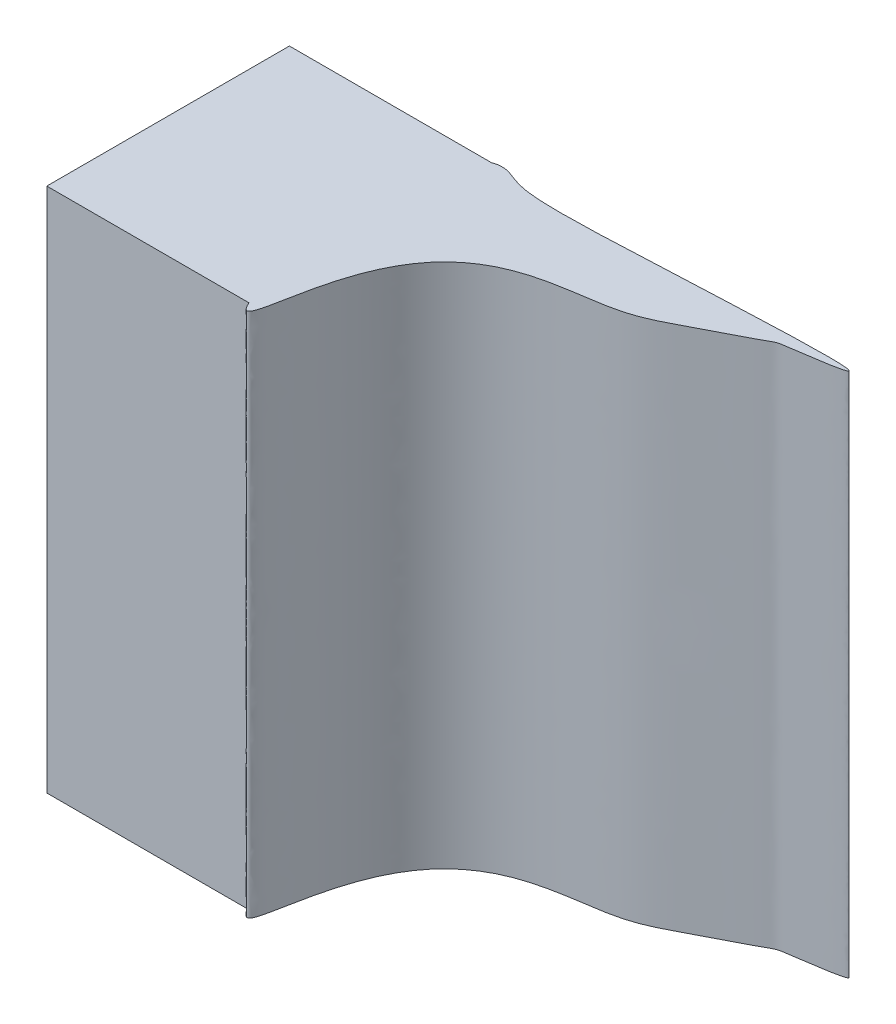
ISO-10303-21;
HEADER;
FILE_DESCRIPTION(('STEP AP214'),'2;1');
FILE_NAME('part.step','',(''),(''),'','','');
FILE_SCHEMA(('AUTOMOTIVE_DESIGN { 1 0 10303 214 1 1 1 1 }'));
ENDSEC;
DATA;
#1=APPLICATION_CONTEXT('core data for automotive mechanical design processes');
#2=APPLICATION_PROTOCOL_DEFINITION('international standard','automotive_design',2000,#1);
#3=PRODUCT_CONTEXT('',#1,'mechanical');
#4=PRODUCT('Part','Part','',(#3));
#5=PRODUCT_RELATED_PRODUCT_CATEGORY('part','',(#4));
#6=PRODUCT_DEFINITION_FORMATION('','',#4);
#7=PRODUCT_DEFINITION_CONTEXT('part definition',#1,'design');
#8=PRODUCT_DEFINITION('design','',#6,#7);
#9=PRODUCT_DEFINITION_SHAPE('','',#8);
#10=(LENGTH_UNIT() NAMED_UNIT(*) SI_UNIT(.MILLI.,.METRE.));
#11=(NAMED_UNIT(*) PLANE_ANGLE_UNIT() SI_UNIT($,.RADIAN.));
#12=(NAMED_UNIT(*) SI_UNIT($,.STERADIAN.) SOLID_ANGLE_UNIT());
#13=UNCERTAINTY_MEASURE_WITH_UNIT(LENGTH_MEASURE(1.E-05),#10,'distance_accuracy_value','');
#14=(GEOMETRIC_REPRESENTATION_CONTEXT(3) GLOBAL_UNCERTAINTY_ASSIGNED_CONTEXT((#13)) GLOBAL_UNIT_ASSIGNED_CONTEXT((#10,
#11,#12)) REPRESENTATION_CONTEXT('',''));
#15=CARTESIAN_POINT('',(0.,0.,0.));
#16=DIRECTION('',(0.,0.,1.));
#17=DIRECTION('',(1.,0.,0.));
#18=AXIS2_PLACEMENT_3D('',#15,#16,#17);
#19=CARTESIAN_POINT('',(1.5,-0.65,0.6));
#20=CARTESIAN_POINT('',(1.5,0.65,0.6));
#21=CARTESIAN_POINT('',(1.504563881529,-0.65,0.610404780283));
#22=CARTESIAN_POINT('',(1.504563881529,0.65,0.610404780283));
#23=CARTESIAN_POINT('',(1.51291263196,-0.65,0.624257488839));
#24=CARTESIAN_POINT('',(1.51291263196,0.65,0.624257488839));
#25=CARTESIAN_POINT('',(1.522864963608,-0.65,0.623392181737));
#26=CARTESIAN_POINT('',(1.522864963608,0.65,0.623392181737));
#27=CARTESIAN_POINT('',(1.532376448188,-0.65,0.581336485311));
#28=CARTESIAN_POINT('',(1.532376448188,0.65,0.581336485311));
#29=CARTESIAN_POINT('',(1.547947909724,-0.65,0.484019566067));
#30=CARTESIAN_POINT('',(1.547947909724,0.65,0.484019566067));
#31=CARTESIAN_POINT('',(1.578830397876,-0.65,0.373071930224));
#32=CARTESIAN_POINT('',(1.578830397876,0.65,0.373071930224));
#33=CARTESIAN_POINT('',(1.633802177616,-0.65,0.277950911439));
#34=CARTESIAN_POINT('',(1.633802177616,0.65,0.277950911439));
#35=CARTESIAN_POINT('',(1.713236071597,-0.65,0.215989500569));
#36=CARTESIAN_POINT('',(1.713236071597,0.65,0.215989500569));
#37=CARTESIAN_POINT('',(1.806406048399,-0.65,0.185155259637));
#38=CARTESIAN_POINT('',(1.806406048399,0.65,0.185155259637));
#39=CARTESIAN_POINT('',(1.897839138036,-0.65,0.172669764408));
#40=CARTESIAN_POINT('',(1.897839138036,0.65,0.172669764408));
#41=CARTESIAN_POINT('',(1.976564091535,-0.65,0.162197163572));
#42=CARTESIAN_POINT('',(1.976564091535,0.65,0.162197163572));
#43=CARTESIAN_POINT('',(2.035852670036,-0.65,0.14014814257));
#44=CARTESIAN_POINT('',(2.035852670036,0.65,0.14014814257));
#45=CARTESIAN_POINT('',(2.096485195646,-0.65,0.105588225382));
#46=CARTESIAN_POINT('',(2.096485195646,0.65,0.105588225382));
#47=CARTESIAN_POINT('',(2.167563170438,-0.65,0.07003553460717));
#48=CARTESIAN_POINT('',(2.167563170438,0.65,0.07003553460717));
#49=CARTESIAN_POINT('',(2.218987488853,-0.65,0.04346748421527));
#50=CARTESIAN_POINT('',(2.218987488853,0.65,0.04346748421527));
#51=CARTESIAN_POINT('',(2.238134291571,-0.65,0.03135503652995));
#52=CARTESIAN_POINT('',(2.238134291571,0.65,0.03135503652995));
#53=CARTESIAN_POINT('',(2.242100979653,-0.65,0.03023663656303));
#54=CARTESIAN_POINT('',(2.242100979653,0.65,0.03023663656303));
#55=CARTESIAN_POINT('',(2.349513732147,-0.65,0.01678314554924));
#56=CARTESIAN_POINT('',(2.349513732147,0.65,0.01678314554924));
#57=CARTESIAN_POINT('',(2.433373343115,-0.65,-0.000462774260499));
#58=CARTESIAN_POINT('',(2.433373343115,0.65,-0.000462774260499));
#59=CARTESIAN_POINT('',(2.325814089705,-0.65,-0.004656521855149));
#60=CARTESIAN_POINT('',(2.325814089705,0.65,-0.004656521855149));
#61=CARTESIAN_POINT('',(2.038956687411,-0.65,0.008440608186372));
#62=CARTESIAN_POINT('',(2.038956687411,0.65,0.008440608186372));
#63=CARTESIAN_POINT('',(1.800875753985,-0.65,0.02072388478313));
#64=CARTESIAN_POINT('',(1.800875753985,0.65,0.02072388478313));
#65=CARTESIAN_POINT('',(1.646458917729,-0.65,0.0248351741419));
#66=CARTESIAN_POINT('',(1.646458917729,0.65,0.0248351741419));
#67=CARTESIAN_POINT('',(1.578984922667,-0.65,0.01640871735164));
#68=CARTESIAN_POINT('',(1.578984922667,0.65,0.01640871735164));
#69=CARTESIAN_POINT('',(1.554976548618,-0.65,0.002515794827033));
#70=CARTESIAN_POINT('',(1.554976548618,0.65,0.002515794827033));
#71=CARTESIAN_POINT('',(1.533569070842,-0.65,-0.00564584669718));
#72=CARTESIAN_POINT('',(1.533569070842,0.65,-0.00564584669718));
#73=CARTESIAN_POINT('',(1.514220808572,-0.65,-0.004760420093226));
#74=CARTESIAN_POINT('',(1.514220808572,0.65,-0.004760420093226));
#75=CARTESIAN_POINT('',(1.502679526612,-0.65,-0.001040931875245));
#76=CARTESIAN_POINT('',(1.502679526612,0.65,-0.001040931875245));
#77=CARTESIAN_POINT('',(1.5,-0.65,0.));
#78=CARTESIAN_POINT('',(1.5,0.65,0.));
#79=B_SPLINE_SURFACE_WITH_KNOTS('',5,1,((#19,#20),(#21,#22),(#23,#24),(#25,#26),(#27,#28),(#29,
#30),(#31,#32),(#33,#34),(#35,#36),(#37,#38),(#39,#40),(#41,#42),(#43,#44),(#45,#46),(#47,#48),
(#49,#50),(#51,#52),(#53,#54),(#55,#56),(#57,#58),(#59,#60),(#61,#62),(#63,#64),(#65,#66),(#67,
#68),(#69,#70),(#71,#72),(#73,#74),(#75,#76),(#77,#78)),.UNSPECIFIED.,.F.,.F.,.F.,(6,1,1,1,1,1,
1,1,1,1,1,1,1,1,1,1,1,1,1,1,1,1,1,1,1,6),(2,2),(0.,0.03333333333333,0.06666666666667,0.1,
0.133333333333,0.166666666667,0.2,0.233333333333,0.266666666667,0.3,0.333333333333,
0.366666666667,0.4,0.433333333333,0.466666666667,0.5,0.533333333333,0.566666666667,0.6,
0.633333333333,0.666666666667,0.7,0.733333333333,0.766666666667,0.8,0.809978898937),(0.,0.13),.UNSPECIFIED.);
#80=CARTESIAN_POINT('',(1.5,-0.65,0.6));
#81=CARTESIAN_POINT('',(1.504563881529,-0.65,0.610404780283));
#82=CARTESIAN_POINT('',(1.51291263196,-0.65,0.624257488839));
#83=CARTESIAN_POINT('',(1.522864963608,-0.65,0.623392181737));
#84=CARTESIAN_POINT('',(1.532376448188,-0.65,0.581336485311));
#85=CARTESIAN_POINT('',(1.547947909724,-0.65,0.484019566067));
#86=CARTESIAN_POINT('',(1.578830397876,-0.65,0.373071930224));
#87=CARTESIAN_POINT('',(1.633802177616,-0.65,0.277950911439));
#88=CARTESIAN_POINT('',(1.713236071597,-0.65,0.215989500569));
#89=CARTESIAN_POINT('',(1.806406048399,-0.65,0.185155259637));
#90=CARTESIAN_POINT('',(1.897839138036,-0.65,0.172669764408));
#91=CARTESIAN_POINT('',(1.976564091535,-0.65,0.162197163572));
#92=CARTESIAN_POINT('',(2.035852670036,-0.65,0.14014814257));
#93=CARTESIAN_POINT('',(2.096485195646,-0.65,0.105588225382));
#94=CARTESIAN_POINT('',(2.167563170438,-0.65,0.07003553460717));
#95=CARTESIAN_POINT('',(2.218987488853,-0.65,0.04346748421527));
#96=CARTESIAN_POINT('',(2.238134291571,-0.65,0.03135503652995));
#97=CARTESIAN_POINT('',(2.242100979653,-0.65,0.03023663656303));
#98=CARTESIAN_POINT('',(2.349513732147,-0.65,0.01678314554924));
#99=CARTESIAN_POINT('',(2.433373343115,-0.65,-0.000462774260499));
#100=CARTESIAN_POINT('',(2.325814089705,-0.65,-0.004656521855149));
#101=CARTESIAN_POINT('',(2.038956687411,-0.65,0.008440608186372));
#102=CARTESIAN_POINT('',(1.800875753985,-0.65,0.02072388478313));
#103=CARTESIAN_POINT('',(1.646458917729,-0.65,0.0248351741419));
#104=CARTESIAN_POINT('',(1.578984922667,-0.65,0.01640871735164));
#105=CARTESIAN_POINT('',(1.554976548618,-0.65,0.002515794827033));
#106=CARTESIAN_POINT('',(1.533569070842,-0.65,-0.00564584669718));
#107=CARTESIAN_POINT('',(1.514220808572,-0.65,-0.004760420093226));
#108=CARTESIAN_POINT('',(1.502679526612,-0.65,-0.001040931875245));
#109=CARTESIAN_POINT('',(1.5,-0.65,0.));
#110=B_SPLINE_CURVE_WITH_KNOTS('',5,(#80,#81,#82,#83,#84,#85,#86,#87,#88,#89,#90,#91,#92,#93,
#94,#95,#96,#97,#98,#99,#100,#101,#102,#103,#104,#105,#106,#107,#108,#109),.UNSPECIFIED.,.F.,
.F.,(6,1,1,1,1,1,1,1,1,1,1,1,1,1,1,1,1,1,1,1,1,1,1,1,1,6),(0.,0.03333333333333,0.06666666666667,
0.1,0.133333333333,0.166666666667,0.2,0.233333333333,0.266666666667,0.3,0.333333333333,
0.366666666667,0.4,0.433333333333,0.466666666667,0.5,0.533333333333,0.566666666667,0.6,
0.633333333333,0.666666666667,0.7,0.733333333333,0.766666666667,0.8,0.809978898937),.UNSPECIFIED.);
#111=CARTESIAN_POINT('',(1.5,-0.65,0.6));
#112=VERTEX_POINT('',#111);
#113=CARTESIAN_POINT('',(1.5,-0.65,0.));
#114=VERTEX_POINT('',#113);
#115=EDGE_CURVE('E11',#112,#114,#110,.T.);
#116=DIRECTION('',(0.,-1.,0.));
#117=VECTOR('',#116,1.);
#118=CARTESIAN_POINT('',(1.5,0.65,0.));
#119=LINE('',#118,#117);
#120=CARTESIAN_POINT('',(1.5,0.65,0.));
#121=VERTEX_POINT('',#120);
#122=EDGE_CURVE('E36',#121,#114,#119,.T.);
#123=CARTESIAN_POINT('',(1.5,0.65,0.6));
#124=CARTESIAN_POINT('',(1.504563881529,0.65,0.610404780283));
#125=CARTESIAN_POINT('',(1.51291263196,0.65,0.624257488839));
#126=CARTESIAN_POINT('',(1.522864963608,0.65,0.623392181737));
#127=CARTESIAN_POINT('',(1.532376448188,0.65,0.581336485311));
#128=CARTESIAN_POINT('',(1.547947909724,0.65,0.484019566067));
#129=CARTESIAN_POINT('',(1.578830397876,0.65,0.373071930224));
#130=CARTESIAN_POINT('',(1.633802177616,0.65,0.277950911439));
#131=CARTESIAN_POINT('',(1.713236071597,0.65,0.215989500569));
#132=CARTESIAN_POINT('',(1.806406048399,0.65,0.185155259637));
#133=CARTESIAN_POINT('',(1.897839138036,0.65,0.172669764408));
#134=CARTESIAN_POINT('',(1.976564091535,0.65,0.162197163572));
#135=CARTESIAN_POINT('',(2.035852670036,0.65,0.14014814257));
#136=CARTESIAN_POINT('',(2.096485195646,0.65,0.105588225382));
#137=CARTESIAN_POINT('',(2.167563170438,0.65,0.07003553460717));
#138=CARTESIAN_POINT('',(2.218987488853,0.65,0.04346748421527));
#139=CARTESIAN_POINT('',(2.238134291571,0.65,0.03135503652995));
#140=CARTESIAN_POINT('',(2.242100979653,0.65,0.03023663656303));
#141=CARTESIAN_POINT('',(2.349513732147,0.65,0.01678314554924));
#142=CARTESIAN_POINT('',(2.433373343115,0.65,-0.000462774260499));
#143=CARTESIAN_POINT('',(2.325814089705,0.65,-0.004656521855149));
#144=CARTESIAN_POINT('',(2.038956687411,0.65,0.008440608186372));
#145=CARTESIAN_POINT('',(1.800875753985,0.65,0.02072388478313));
#146=CARTESIAN_POINT('',(1.646458917729,0.65,0.0248351741419));
#147=CARTESIAN_POINT('',(1.578984922667,0.65,0.01640871735164));
#148=CARTESIAN_POINT('',(1.554976548618,0.65,0.002515794827033));
#149=CARTESIAN_POINT('',(1.533569070842,0.65,-0.00564584669718));
#150=CARTESIAN_POINT('',(1.514220808572,0.65,-0.004760420093226));
#151=CARTESIAN_POINT('',(1.502679526612,0.65,-0.001040931875245));
#152=CARTESIAN_POINT('',(1.5,0.65,0.));
#153=B_SPLINE_CURVE_WITH_KNOTS('',5,(#123,#124,#125,#126,#127,#128,#129,#130,#131,#132,#133,
#134,#135,#136,#137,#138,#139,#140,#141,#142,#143,#144,#145,#146,#147,#148,#149,#150,#151,#152),
.UNSPECIFIED.,.F.,.F.,(6,1,1,1,1,1,1,1,1,1,1,1,1,1,1,1,1,1,1,1,1,1,1,1,1,6),(0.,
0.03333333333333,0.06666666666667,0.1,0.133333333333,0.166666666667,0.2,0.233333333333,
0.266666666667,0.3,0.333333333333,0.366666666667,0.4,0.433333333333,0.466666666667,0.5,
0.533333333333,0.566666666667,0.6,0.633333333333,0.666666666667,0.7,0.733333333333,
0.766666666667,0.8,0.809978898937),.UNSPECIFIED.);
#154=CARTESIAN_POINT('',(1.5,0.65,0.6));
#155=VERTEX_POINT('',#154);
#156=EDGE_CURVE('E68',#155,#121,#153,.T.);
#157=DIRECTION('',(0.,1.,0.));
#158=VECTOR('',#157,1.);
#159=CARTESIAN_POINT('',(1.5,0.65,0.6));
#160=LINE('',#159,#158);
#161=EDGE_CURVE('E79',#112,#155,#160,.T.);
#162=ORIENTED_EDGE('',*,*,#115,.T.);
#163=ORIENTED_EDGE('',*,*,#122,.F.);
#164=ORIENTED_EDGE('',*,*,#156,.F.);
#165=ORIENTED_EDGE('',*,*,#161,.F.);
#166=EDGE_LOOP('',(#162,#163,#164,#165));
#167=FACE_BOUND('',#166,.T.);
#168=ADVANCED_FACE('F17',(#167),#79,.T.);
#169=CARTESIAN_POINT('',(1.,0.,0.3));
#170=DIRECTION('',(1.,0.,0.));
#171=DIRECTION('',(0.,0.,-1.));
#172=AXIS2_PLACEMENT_3D('',#169,#170,#171);
#173=PLANE('',#172);
#174=DIRECTION('',(0.,0.,-1.));
#175=VECTOR('',#174,1.);
#176=CARTESIAN_POINT('',(1.,-0.65,0.15));
#177=LINE('',#176,#175);
#178=CARTESIAN_POINT('',(1.,-0.65,0.6));
#179=VERTEX_POINT('',#178);
#180=CARTESIAN_POINT('',(1.,-0.65,0.));
#181=VERTEX_POINT('',#180);
#182=EDGE_CURVE('E62',#179,#181,#177,.T.);
#183=ORIENTED_EDGE('',*,*,#182,.F.);
#184=DIRECTION('',(0.,-1.,0.));
#185=VECTOR('',#184,1.);
#186=CARTESIAN_POINT('',(1.,0.,0.6));
#187=LINE('',#186,#185);
#188=CARTESIAN_POINT('',(1.,0.65,0.6));
#189=VERTEX_POINT('',#188);
#190=EDGE_CURVE('E54',#189,#179,#187,.T.);
#191=ORIENTED_EDGE('',*,*,#190,.F.);
#192=DIRECTION('',(0.,0.,1.));
#193=VECTOR('',#192,1.);
#194=CARTESIAN_POINT('',(1.,0.65,0.15));
#195=LINE('',#194,#193);
#196=CARTESIAN_POINT('',(1.,0.65,0.));
#197=VERTEX_POINT('',#196);
#198=EDGE_CURVE('E27',#197,#189,#195,.T.);
#199=ORIENTED_EDGE('',*,*,#198,.F.);
#200=DIRECTION('',(0.,1.,0.));
#201=VECTOR('',#200,1.);
#202=CARTESIAN_POINT('',(1.,0.,0.));
#203=LINE('',#202,#201);
#204=EDGE_CURVE('E57',#181,#197,#203,.T.);
#205=ORIENTED_EDGE('',*,*,#204,.F.);
#206=EDGE_LOOP('',(#183,#191,#199,#205));
#207=FACE_BOUND('',#206,.T.);
#208=ADVANCED_FACE('F64',(#207),#173,.F.);
#209=CARTESIAN_POINT('',(1.5,0.65,0.));
#210=DIRECTION('',(0.,1.,0.));
#211=DIRECTION('',(-1.,0.,0.));
#212=AXIS2_PLACEMENT_3D('',#209,#210,#211);
#213=PLANE('',#212);
#214=ORIENTED_EDGE('',*,*,#198,.T.);
#215=DIRECTION('',(-1.,0.,0.));
#216=VECTOR('',#215,1.);
#217=CARTESIAN_POINT('',(-1.5,0.65,0.6));
#218=LINE('',#217,#216);
#219=EDGE_CURVE('E76',#155,#189,#218,.T.);
#220=ORIENTED_EDGE('',*,*,#219,.F.);
#221=ORIENTED_EDGE('',*,*,#156,.T.);
#222=DIRECTION('',(1.,0.,0.));
#223=VECTOR('',#222,1.);
#224=CARTESIAN_POINT('',(-1.5,0.65,0.));
#225=LINE('',#224,#223);
#226=EDGE_CURVE('E59',#197,#121,#225,.T.);
#227=ORIENTED_EDGE('',*,*,#226,.F.);
#228=EDGE_LOOP('',(#214,#220,#221,#227));
#229=FACE_BOUND('',#228,.T.);
#230=ADVANCED_FACE('F71',(#229),#213,.T.);
#231=CARTESIAN_POINT('',(0.,0.,0.6));
#232=DIRECTION('',(0.,0.,1.));
#233=DIRECTION('',(1.,0.,0.));
#234=AXIS2_PLACEMENT_3D('',#231,#232,#233);
#235=PLANE('',#234);
#236=ORIENTED_EDGE('',*,*,#190,.T.);
#237=DIRECTION('',(1.,0.,0.));
#238=VECTOR('',#237,1.);
#239=CARTESIAN_POINT('',(1.5,-0.65,0.6));
#240=LINE('',#239,#238);
#241=EDGE_CURVE('E77',#179,#112,#240,.T.);
#242=ORIENTED_EDGE('',*,*,#241,.T.);
#243=ORIENTED_EDGE('',*,*,#161,.T.);
#244=ORIENTED_EDGE('',*,*,#219,.T.);
#245=EDGE_LOOP('',(#236,#242,#243,#244));
#246=FACE_BOUND('',#245,.T.);
#247=ADVANCED_FACE('F92',(#246),#235,.T.);
#248=CARTESIAN_POINT('',(-1.5,-0.65,0.));
#249=DIRECTION('',(0.,-1.,0.));
#250=DIRECTION('',(1.,0.,0.));
#251=AXIS2_PLACEMENT_3D('',#248,#249,#250);
#252=PLANE('',#251);
#253=ORIENTED_EDGE('',*,*,#182,.T.);
#254=DIRECTION('',(-1.,0.,0.));
#255=VECTOR('',#254,1.);
#256=CARTESIAN_POINT('',(1.5,-0.65,0.));
#257=LINE('',#256,#255);
#258=EDGE_CURVE('E21',#114,#181,#257,.T.);
#259=ORIENTED_EDGE('',*,*,#258,.F.);
#260=ORIENTED_EDGE('',*,*,#115,.F.);
#261=ORIENTED_EDGE('',*,*,#241,.F.);
#262=EDGE_LOOP('',(#253,#259,#260,#261));
#263=FACE_BOUND('',#262,.T.);
#264=ADVANCED_FACE('F90',(#263),#252,.T.);
#265=CARTESIAN_POINT('',(0.,0.,0.));
#266=DIRECTION('',(0.,0.,1.));
#267=DIRECTION('',(1.,0.,0.));
#268=AXIS2_PLACEMENT_3D('',#265,#266,#267);
#269=PLANE('',#268);
#270=ORIENTED_EDGE('',*,*,#204,.T.);
#271=ORIENTED_EDGE('',*,*,#226,.T.);
#272=ORIENTED_EDGE('',*,*,#122,.T.);
#273=ORIENTED_EDGE('',*,*,#258,.T.);
#274=EDGE_LOOP('',(#270,#271,#272,#273));
#275=FACE_BOUND('',#274,.T.);
#276=ADVANCED_FACE('F19',(#275),#269,.F.);
#277=CLOSED_SHELL('',(#168,#208,#230,#247,#264,#276));
#278=MANIFOLD_SOLID_BREP('B1',#277);
#279=ADVANCED_BREP_SHAPE_REPRESENTATION('',(#18,#278),#14);
#280=SHAPE_DEFINITION_REPRESENTATION(#9,#279);
ENDSEC;
END-ISO-10303-21;
